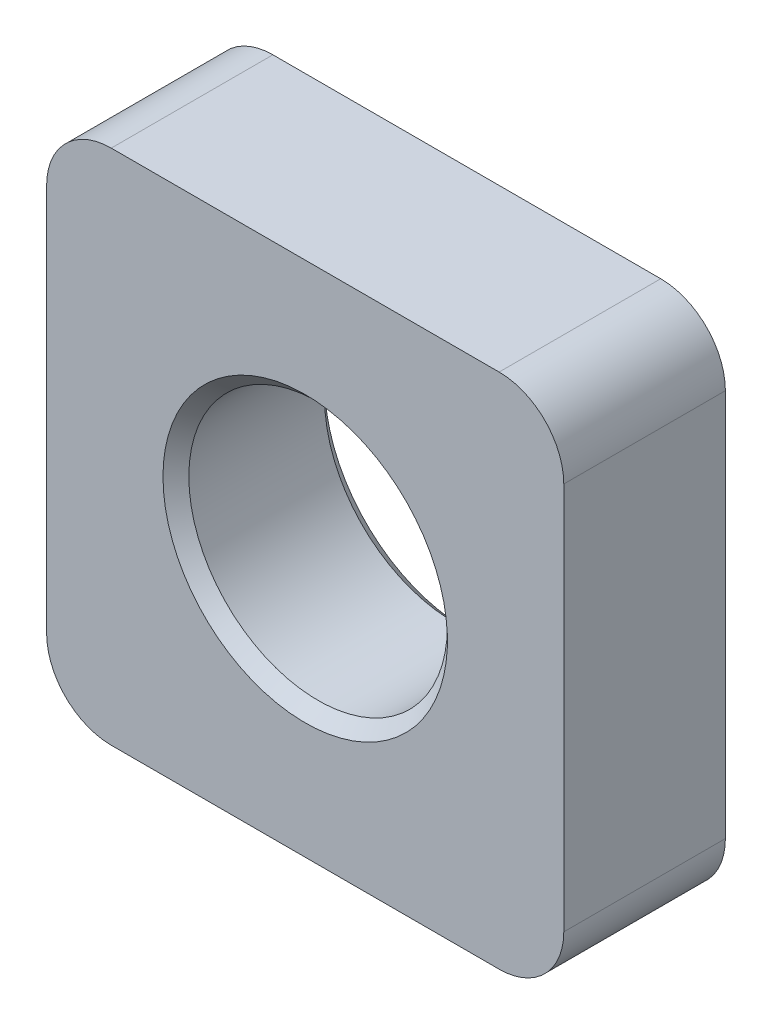
ISO-10303-21;
HEADER;
FILE_DESCRIPTION(('STEP AP214'),'2;1');
FILE_NAME('part.step','',(''),(''),'','','');
FILE_SCHEMA(('AUTOMOTIVE_DESIGN { 1 0 10303 214 1 1 1 1 }'));
ENDSEC;
DATA;
#1=APPLICATION_CONTEXT('core data for automotive mechanical design processes');
#2=APPLICATION_PROTOCOL_DEFINITION('international standard','automotive_design',2000,#1);
#3=PRODUCT_CONTEXT('',#1,'mechanical');
#4=PRODUCT('Part','Part','',(#3));
#5=PRODUCT_RELATED_PRODUCT_CATEGORY('part','',(#4));
#6=PRODUCT_DEFINITION_FORMATION('','',#4);
#7=PRODUCT_DEFINITION_CONTEXT('part definition',#1,'design');
#8=PRODUCT_DEFINITION('design','',#6,#7);
#9=PRODUCT_DEFINITION_SHAPE('','',#8);
#10=(LENGTH_UNIT() NAMED_UNIT(*) SI_UNIT(.MILLI.,.METRE.));
#11=(NAMED_UNIT(*) PLANE_ANGLE_UNIT() SI_UNIT($,.RADIAN.));
#12=(NAMED_UNIT(*) SI_UNIT($,.STERADIAN.) SOLID_ANGLE_UNIT());
#13=UNCERTAINTY_MEASURE_WITH_UNIT(LENGTH_MEASURE(1.E-05),#10,'distance_accuracy_value','');
#14=(GEOMETRIC_REPRESENTATION_CONTEXT(3) GLOBAL_UNCERTAINTY_ASSIGNED_CONTEXT((#13)) GLOBAL_UNIT_ASSIGNED_CONTEXT((#10,
#11,#12)) REPRESENTATION_CONTEXT('',''));
#15=CARTESIAN_POINT('',(0.,0.,0.));
#16=DIRECTION('',(0.,0.,1.));
#17=DIRECTION('',(1.,0.,0.));
#18=AXIS2_PLACEMENT_3D('',#15,#16,#17);
#19=CARTESIAN_POINT('',(0.,0.,2.5));
#20=DIRECTION('',(0.,0.,-1.));
#21=DIRECTION('',(-1.,0.,0.));
#22=AXIS2_PLACEMENT_3D('',#19,#20,#21);
#23=PLANE('',#22);
#24=CARTESIAN_POINT('',(0.,0.,2.5));
#25=DIRECTION('',(0.,0.,-1.));
#26=DIRECTION('',(-1.,0.,0.));
#27=AXIS2_PLACEMENT_3D('',#24,#25,#26);
#28=CIRCLE('',#27,2.2);
#29=CARTESIAN_POINT('',(-2.2,0.,2.5));
#30=VERTEX_POINT('',#29);
#31=EDGE_CURVE('E129',#30,#30,#28,.T.);
#32=ORIENTED_EDGE('',*,*,#31,.T.);
#33=EDGE_LOOP('',(#32));
#34=FACE_BOUND('',#33,.T.);
#35=DIRECTION('',(0.,1.,0.));
#36=VECTOR('',#35,1.);
#37=CARTESIAN_POINT('',(4.,-4.,2.5));
#38=LINE('',#37,#36);
#39=CARTESIAN_POINT('',(4.,-3.,2.5));
#40=VERTEX_POINT('',#39);
#41=CARTESIAN_POINT('',(4.,3.,2.5));
#42=VERTEX_POINT('',#41);
#43=EDGE_CURVE('E118',#40,#42,#38,.T.);
#44=ORIENTED_EDGE('',*,*,#43,.T.);
#45=CARTESIAN_POINT('',(3.,3.,2.5));
#46=DIRECTION('',(0.,0.,-1.));
#47=DIRECTION('',(-1.,0.,0.));
#48=AXIS2_PLACEMENT_3D('',#45,#46,#47);
#49=CIRCLE('',#48,1.);
#50=CARTESIAN_POINT('',(3.,4.,2.5));
#51=VERTEX_POINT('',#50);
#52=EDGE_CURVE('E148',#42,#51,#49,.F.);
#53=ORIENTED_EDGE('',*,*,#52,.T.);
#54=DIRECTION('',(-1.,0.,0.));
#55=VECTOR('',#54,1.);
#56=CARTESIAN_POINT('',(-4.,4.,2.5));
#57=LINE('',#56,#55);
#58=CARTESIAN_POINT('',(-3.,4.,2.5));
#59=VERTEX_POINT('',#58);
#60=EDGE_CURVE('E103',#51,#59,#57,.T.);
#61=ORIENTED_EDGE('',*,*,#60,.T.);
#62=CARTESIAN_POINT('',(-3.,3.,2.5));
#63=DIRECTION('',(0.,0.,-1.));
#64=DIRECTION('',(-1.,0.,0.));
#65=AXIS2_PLACEMENT_3D('',#62,#63,#64);
#66=CIRCLE('',#65,1.);
#67=CARTESIAN_POINT('',(-4.,3.,2.5));
#68=VERTEX_POINT('',#67);
#69=EDGE_CURVE('E145',#59,#68,#66,.F.);
#70=ORIENTED_EDGE('',*,*,#69,.T.);
#71=DIRECTION('',(0.,-1.,0.));
#72=VECTOR('',#71,1.);
#73=CARTESIAN_POINT('',(-4.,-4.,2.5));
#74=LINE('',#73,#72);
#75=CARTESIAN_POINT('',(-4.,-3.,2.5));
#76=VERTEX_POINT('',#75);
#77=EDGE_CURVE('E160',#68,#76,#74,.T.);
#78=ORIENTED_EDGE('',*,*,#77,.T.);
#79=CARTESIAN_POINT('',(-3.,-3.,2.5));
#80=DIRECTION('',(0.,0.,-1.));
#81=DIRECTION('',(-1.,0.,0.));
#82=AXIS2_PLACEMENT_3D('',#79,#80,#81);
#83=CIRCLE('',#82,1.);
#84=CARTESIAN_POINT('',(-3.,-4.,2.5));
#85=VERTEX_POINT('',#84);
#86=EDGE_CURVE('E36',#76,#85,#83,.F.);
#87=ORIENTED_EDGE('',*,*,#86,.T.);
#88=DIRECTION('',(1.,0.,0.));
#89=VECTOR('',#88,1.);
#90=CARTESIAN_POINT('',(-4.,-4.,2.5));
#91=LINE('',#90,#89);
#92=CARTESIAN_POINT('',(3.,-4.,2.5));
#93=VERTEX_POINT('',#92);
#94=EDGE_CURVE('E121',#85,#93,#91,.T.);
#95=ORIENTED_EDGE('',*,*,#94,.T.);
#96=CARTESIAN_POINT('',(3.,-3.,2.5));
#97=DIRECTION('',(0.,0.,-1.));
#98=DIRECTION('',(-1.,0.,0.));
#99=AXIS2_PLACEMENT_3D('',#96,#97,#98);
#100=CIRCLE('',#99,1.);
#101=EDGE_CURVE('E143',#93,#40,#100,.F.);
#102=ORIENTED_EDGE('',*,*,#101,.T.);
#103=EDGE_LOOP('',(#44,#53,#61,#70,#78,#87,#95,#102));
#104=FACE_BOUND('',#103,.T.);
#105=ADVANCED_FACE('F17',(#34,#104),#23,.F.);
#106=CARTESIAN_POINT('',(0.,0.,0.));
#107=DIRECTION('',(0.,0.,-1.));
#108=DIRECTION('',(-1.,0.,0.));
#109=AXIS2_PLACEMENT_3D('',#106,#107,#108);
#110=PLANE('',#109);
#111=CARTESIAN_POINT('',(0.,0.,0.));
#112=DIRECTION('',(0.,0.,-1.));
#113=DIRECTION('',(-1.,0.,0.));
#114=AXIS2_PLACEMENT_3D('',#111,#112,#113);
#115=CIRCLE('',#114,2.2);
#116=CARTESIAN_POINT('',(-2.2,0.,0.));
#117=VERTEX_POINT('',#116);
#118=EDGE_CURVE('E120',#117,#117,#115,.F.);
#119=ORIENTED_EDGE('',*,*,#118,.T.);
#120=EDGE_LOOP('',(#119));
#121=FACE_BOUND('',#120,.T.);
#122=DIRECTION('',(-1.,0.,0.));
#123=VECTOR('',#122,1.);
#124=CARTESIAN_POINT('',(-4.,4.,0.));
#125=LINE('',#124,#123);
#126=CARTESIAN_POINT('',(3.,4.,0.));
#127=VERTEX_POINT('',#126);
#128=CARTESIAN_POINT('',(-3.,4.,0.));
#129=VERTEX_POINT('',#128);
#130=EDGE_CURVE('E99',#127,#129,#125,.T.);
#131=ORIENTED_EDGE('',*,*,#130,.F.);
#132=CARTESIAN_POINT('',(3.,3.,0.));
#133=DIRECTION('',(0.,0.,-1.));
#134=DIRECTION('',(-1.,0.,0.));
#135=AXIS2_PLACEMENT_3D('',#132,#133,#134);
#136=CIRCLE('',#135,1.);
#137=CARTESIAN_POINT('',(4.,3.,0.));
#138=VERTEX_POINT('',#137);
#139=EDGE_CURVE('E83',#127,#138,#136,.T.);
#140=ORIENTED_EDGE('',*,*,#139,.T.);
#141=DIRECTION('',(0.,1.,0.));
#142=VECTOR('',#141,1.);
#143=CARTESIAN_POINT('',(4.,-4.,0.));
#144=LINE('',#143,#142);
#145=CARTESIAN_POINT('',(4.,-3.,0.));
#146=VERTEX_POINT('',#145);
#147=EDGE_CURVE('E109',#146,#138,#144,.T.);
#148=ORIENTED_EDGE('',*,*,#147,.F.);
#149=CARTESIAN_POINT('',(3.,-3.,0.));
#150=DIRECTION('',(0.,0.,-1.));
#151=DIRECTION('',(-1.,0.,0.));
#152=AXIS2_PLACEMENT_3D('',#149,#150,#151);
#153=CIRCLE('',#152,1.);
#154=CARTESIAN_POINT('',(3.,-4.,0.));
#155=VERTEX_POINT('',#154);
#156=EDGE_CURVE('E102',#146,#155,#153,.T.);
#157=ORIENTED_EDGE('',*,*,#156,.T.);
#158=DIRECTION('',(1.,0.,0.));
#159=VECTOR('',#158,1.);
#160=CARTESIAN_POINT('',(-4.,-4.,0.));
#161=LINE('',#160,#159);
#162=CARTESIAN_POINT('',(-3.,-4.,0.));
#163=VERTEX_POINT('',#162);
#164=EDGE_CURVE('E114',#163,#155,#161,.T.);
#165=ORIENTED_EDGE('',*,*,#164,.F.);
#166=CARTESIAN_POINT('',(-3.,-3.,0.));
#167=DIRECTION('',(0.,0.,-1.));
#168=DIRECTION('',(-1.,0.,0.));
#169=AXIS2_PLACEMENT_3D('',#166,#167,#168);
#170=CIRCLE('',#169,1.);
#171=CARTESIAN_POINT('',(-4.,-3.,0.));
#172=VERTEX_POINT('',#171);
#173=EDGE_CURVE('E134',#163,#172,#170,.T.);
#174=ORIENTED_EDGE('',*,*,#173,.T.);
#175=DIRECTION('',(0.,-1.,0.));
#176=VECTOR('',#175,1.);
#177=CARTESIAN_POINT('',(-4.,-4.,0.));
#178=LINE('',#177,#176);
#179=CARTESIAN_POINT('',(-4.,3.,0.));
#180=VERTEX_POINT('',#179);
#181=EDGE_CURVE('E108',#180,#172,#178,.T.);
#182=ORIENTED_EDGE('',*,*,#181,.F.);
#183=CARTESIAN_POINT('',(-3.,3.,0.));
#184=DIRECTION('',(0.,0.,-1.));
#185=DIRECTION('',(-1.,0.,0.));
#186=AXIS2_PLACEMENT_3D('',#183,#184,#185);
#187=CIRCLE('',#186,1.);
#188=EDGE_CURVE('E94',#180,#129,#187,.T.);
#189=ORIENTED_EDGE('',*,*,#188,.T.);
#190=EDGE_LOOP('',(#131,#140,#148,#157,#165,#174,#182,#189));
#191=FACE_BOUND('',#190,.T.);
#192=ADVANCED_FACE('F110',(#121,#191),#110,.T.);
#193=CARTESIAN_POINT('',(4.,-4.,2.5));
#194=DIRECTION('',(-1.,0.,0.));
#195=DIRECTION('',(0.,0.,1.));
#196=AXIS2_PLACEMENT_3D('',#193,#194,#195);
#197=PLANE('',#196);
#198=ORIENTED_EDGE('',*,*,#147,.T.);
#199=DIRECTION('',(0.,0.,-1.));
#200=VECTOR('',#199,1.);
#201=CARTESIAN_POINT('',(4.,3.,2.5));
#202=LINE('',#201,#200);
#203=EDGE_CURVE('E86',#138,#42,#202,.F.);
#204=ORIENTED_EDGE('',*,*,#203,.T.);
#205=ORIENTED_EDGE('',*,*,#43,.F.);
#206=DIRECTION('',(0.,0.,-1.));
#207=VECTOR('',#206,1.);
#208=CARTESIAN_POINT('',(4.,-3.,2.5));
#209=LINE('',#208,#207);
#210=EDGE_CURVE('E91',#40,#146,#209,.T.);
#211=ORIENTED_EDGE('',*,*,#210,.T.);
#212=EDGE_LOOP('',(#198,#204,#205,#211));
#213=FACE_BOUND('',#212,.T.);
#214=ADVANCED_FACE('F174',(#213),#197,.F.);
#215=CARTESIAN_POINT('',(-4.,4.,2.5));
#216=DIRECTION('',(0.,-1.,0.));
#217=DIRECTION('',(0.,0.,-1.));
#218=AXIS2_PLACEMENT_3D('',#215,#216,#217);
#219=PLANE('',#218);
#220=ORIENTED_EDGE('',*,*,#60,.F.);
#221=DIRECTION('',(0.,0.,-1.));
#222=VECTOR('',#221,1.);
#223=CARTESIAN_POINT('',(3.,4.,2.5));
#224=LINE('',#223,#222);
#225=EDGE_CURVE('E87',#51,#127,#224,.T.);
#226=ORIENTED_EDGE('',*,*,#225,.T.);
#227=ORIENTED_EDGE('',*,*,#130,.T.);
#228=DIRECTION('',(0.,0.,-1.));
#229=VECTOR('',#228,1.);
#230=CARTESIAN_POINT('',(-3.,4.,2.5));
#231=LINE('',#230,#229);
#232=EDGE_CURVE('E104',#129,#59,#231,.F.);
#233=ORIENTED_EDGE('',*,*,#232,.T.);
#234=EDGE_LOOP('',(#220,#226,#227,#233));
#235=FACE_BOUND('',#234,.T.);
#236=ADVANCED_FACE('F97',(#235),#219,.F.);
#237=CARTESIAN_POINT('',(-4.,-4.,2.5));
#238=DIRECTION('',(1.,0.,0.));
#239=DIRECTION('',(0.,0.,-1.));
#240=AXIS2_PLACEMENT_3D('',#237,#238,#239);
#241=PLANE('',#240);
#242=ORIENTED_EDGE('',*,*,#77,.F.);
#243=DIRECTION('',(0.,0.,-1.));
#244=VECTOR('',#243,1.);
#245=CARTESIAN_POINT('',(-4.,3.,2.5));
#246=LINE('',#245,#244);
#247=EDGE_CURVE('E147',#68,#180,#246,.T.);
#248=ORIENTED_EDGE('',*,*,#247,.T.);
#249=ORIENTED_EDGE('',*,*,#181,.T.);
#250=DIRECTION('',(0.,0.,-1.));
#251=VECTOR('',#250,1.);
#252=CARTESIAN_POINT('',(-4.,-3.,2.5));
#253=LINE('',#252,#251);
#254=EDGE_CURVE('E146',#172,#76,#253,.F.);
#255=ORIENTED_EDGE('',*,*,#254,.T.);
#256=EDGE_LOOP('',(#242,#248,#249,#255));
#257=FACE_BOUND('',#256,.T.);
#258=ADVANCED_FACE('F154',(#257),#241,.F.);
#259=CARTESIAN_POINT('',(-4.,-4.,2.5));
#260=DIRECTION('',(0.,1.,0.));
#261=DIRECTION('',(0.,0.,1.));
#262=AXIS2_PLACEMENT_3D('',#259,#260,#261);
#263=PLANE('',#262);
#264=ORIENTED_EDGE('',*,*,#94,.F.);
#265=DIRECTION('',(0.,0.,-1.));
#266=VECTOR('',#265,1.);
#267=CARTESIAN_POINT('',(-3.,-4.,2.5));
#268=LINE('',#267,#266);
#269=EDGE_CURVE('E11',#85,#163,#268,.T.);
#270=ORIENTED_EDGE('',*,*,#269,.T.);
#271=ORIENTED_EDGE('',*,*,#164,.T.);
#272=DIRECTION('',(0.,0.,-1.));
#273=VECTOR('',#272,1.);
#274=CARTESIAN_POINT('',(3.,-4.,2.5));
#275=LINE('',#274,#273);
#276=EDGE_CURVE('E25',#155,#93,#275,.F.);
#277=ORIENTED_EDGE('',*,*,#276,.T.);
#278=EDGE_LOOP('',(#264,#270,#271,#277));
#279=FACE_BOUND('',#278,.T.);
#280=ADVANCED_FACE('F163',(#279),#263,.F.);
#281=CARTESIAN_POINT('',(0.,0.,2.5));
#282=DIRECTION('',(0.,0.,-1.));
#283=DIRECTION('',(-1.,0.,0.));
#284=AXIS2_PLACEMENT_3D('',#281,#282,#283);
#285=CYLINDRICAL_SURFACE('',#284,2.);
#286=CARTESIAN_POINT('',(0.,0.,0.200000000000003));
#287=DIRECTION('',(0.,0.,-1.));
#288=DIRECTION('',(-1.,0.,0.));
#289=AXIS2_PLACEMENT_3D('',#286,#287,#288);
#290=CIRCLE('',#289,2.);
#291=CARTESIAN_POINT('',(-2.,0.,0.200000000000003));
#292=VERTEX_POINT('',#291);
#293=EDGE_CURVE('E126',#292,#292,#290,.T.);
#294=ORIENTED_EDGE('',*,*,#293,.T.);
#295=EDGE_LOOP('',(#294));
#296=FACE_BOUND('',#295,.T.);
#297=CARTESIAN_POINT('',(0.,0.,2.3));
#298=DIRECTION('',(0.,0.,-1.));
#299=DIRECTION('',(-1.,0.,0.));
#300=AXIS2_PLACEMENT_3D('',#297,#298,#299);
#301=CIRCLE('',#300,2.);
#302=CARTESIAN_POINT('',(-2.,0.,2.3));
#303=VERTEX_POINT('',#302);
#304=EDGE_CURVE('E124',#303,#303,#301,.F.);
#305=ORIENTED_EDGE('',*,*,#304,.T.);
#306=EDGE_LOOP('',(#305));
#307=FACE_BOUND('',#306,.T.);
#308=ADVANCED_FACE('F195',(#296,#307),#285,.F.);
#309=CARTESIAN_POINT('',(0.,0.,0.));
#310=DIRECTION('',(0.,0.,-1.));
#311=DIRECTION('',(-1.,0.,0.));
#312=AXIS2_PLACEMENT_3D('',#309,#310,#311);
#313=CONICAL_SURFACE('',#312,2.2,0.785398163397444);
#314=ORIENTED_EDGE('',*,*,#293,.F.);
#315=EDGE_LOOP('',(#314));
#316=FACE_BOUND('',#315,.T.);
#317=ORIENTED_EDGE('',*,*,#118,.F.);
#318=EDGE_LOOP('',(#317));
#319=FACE_BOUND('',#318,.T.);
#320=ADVANCED_FACE('F205',(#316,#319),#313,.F.);
#321=CARTESIAN_POINT('',(0.,0.,2.3));
#322=DIRECTION('',(0.,0.,1.));
#323=DIRECTION('',(1.,0.,0.));
#324=AXIS2_PLACEMENT_3D('',#321,#322,#323);
#325=CONICAL_SURFACE('',#324,2.,0.785398163397452);
#326=ORIENTED_EDGE('',*,*,#31,.F.);
#327=EDGE_LOOP('',(#326));
#328=FACE_BOUND('',#327,.T.);
#329=ORIENTED_EDGE('',*,*,#304,.F.);
#330=EDGE_LOOP('',(#329));
#331=FACE_BOUND('',#330,.T.);
#332=ADVANCED_FACE('F202',(#328,#331),#325,.F.);
#333=CARTESIAN_POINT('',(3.,3.,2.5));
#334=DIRECTION('',(0.,0.,-1.));
#335=DIRECTION('',(-1.,0.,0.));
#336=AXIS2_PLACEMENT_3D('',#333,#334,#335);
#337=CYLINDRICAL_SURFACE('',#336,1.);
#338=ORIENTED_EDGE('',*,*,#52,.F.);
#339=ORIENTED_EDGE('',*,*,#203,.F.);
#340=ORIENTED_EDGE('',*,*,#139,.F.);
#341=ORIENTED_EDGE('',*,*,#225,.F.);
#342=EDGE_LOOP('',(#338,#339,#340,#341));
#343=FACE_BOUND('',#342,.T.);
#344=ADVANCED_FACE('F88',(#343),#337,.T.);
#345=CARTESIAN_POINT('',(-3.,3.,2.5));
#346=DIRECTION('',(0.,0.,-1.));
#347=DIRECTION('',(-1.,0.,0.));
#348=AXIS2_PLACEMENT_3D('',#345,#346,#347);
#349=CYLINDRICAL_SURFACE('',#348,1.);
#350=ORIENTED_EDGE('',*,*,#69,.F.);
#351=ORIENTED_EDGE('',*,*,#232,.F.);
#352=ORIENTED_EDGE('',*,*,#188,.F.);
#353=ORIENTED_EDGE('',*,*,#247,.F.);
#354=EDGE_LOOP('',(#350,#351,#352,#353));
#355=FACE_BOUND('',#354,.T.);
#356=ADVANCED_FACE('F185',(#355),#349,.T.);
#357=CARTESIAN_POINT('',(-3.,-3.,2.5));
#358=DIRECTION('',(0.,0.,-1.));
#359=DIRECTION('',(-1.,0.,0.));
#360=AXIS2_PLACEMENT_3D('',#357,#358,#359);
#361=CYLINDRICAL_SURFACE('',#360,1.);
#362=ORIENTED_EDGE('',*,*,#86,.F.);
#363=ORIENTED_EDGE('',*,*,#254,.F.);
#364=ORIENTED_EDGE('',*,*,#173,.F.);
#365=ORIENTED_EDGE('',*,*,#269,.F.);
#366=EDGE_LOOP('',(#362,#363,#364,#365));
#367=FACE_BOUND('',#366,.T.);
#368=ADVANCED_FACE('F162',(#367),#361,.T.);
#369=CARTESIAN_POINT('',(3.,-3.,2.5));
#370=DIRECTION('',(0.,0.,-1.));
#371=DIRECTION('',(-1.,0.,0.));
#372=AXIS2_PLACEMENT_3D('',#369,#370,#371);
#373=CYLINDRICAL_SURFACE('',#372,1.);
#374=ORIENTED_EDGE('',*,*,#101,.F.);
#375=ORIENTED_EDGE('',*,*,#276,.F.);
#376=ORIENTED_EDGE('',*,*,#156,.F.);
#377=ORIENTED_EDGE('',*,*,#210,.F.);
#378=EDGE_LOOP('',(#374,#375,#376,#377));
#379=FACE_BOUND('',#378,.T.);
#380=ADVANCED_FACE('F19',(#379),#373,.T.);
#381=CLOSED_SHELL('',(#105,#192,#214,#236,#258,#280,#308,#320,#332,#344,#356,#368,#380));
#382=MANIFOLD_SOLID_BREP('B1',#381);
#383=ADVANCED_BREP_SHAPE_REPRESENTATION('',(#18,#382),#14);
#384=SHAPE_DEFINITION_REPRESENTATION(#9,#383);
ENDSEC;
END-ISO-10303-21;
